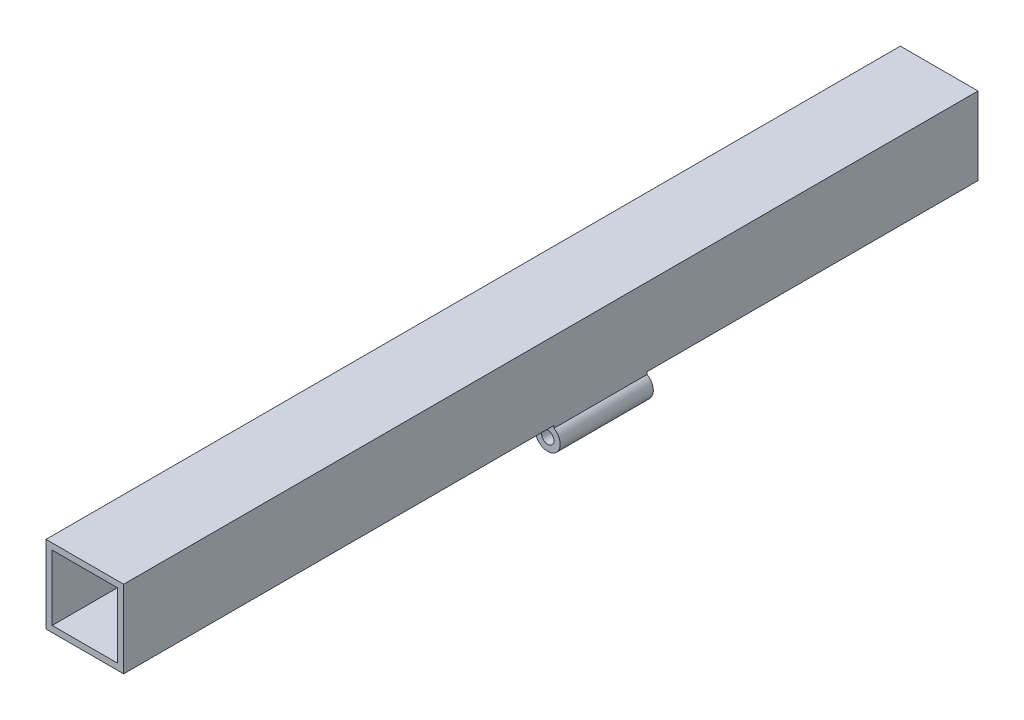
ISO-10303-21;
HEADER;
FILE_DESCRIPTION(('STEP AP214'),'2;1');
FILE_NAME('part.step','',(''),(''),'','','');
FILE_SCHEMA(('AUTOMOTIVE_DESIGN { 1 0 10303 214 1 1 1 1 }'));
ENDSEC;
DATA;
#1=APPLICATION_CONTEXT('core data for automotive mechanical design processes');
#2=APPLICATION_PROTOCOL_DEFINITION('international standard','automotive_design',2000,#1);
#3=PRODUCT_CONTEXT('',#1,'mechanical');
#4=PRODUCT('Part','Part','',(#3));
#5=PRODUCT_RELATED_PRODUCT_CATEGORY('part','',(#4));
#6=PRODUCT_DEFINITION_FORMATION('','',#4);
#7=PRODUCT_DEFINITION_CONTEXT('part definition',#1,'design');
#8=PRODUCT_DEFINITION('design','',#6,#7);
#9=PRODUCT_DEFINITION_SHAPE('','',#8);
#10=(LENGTH_UNIT() NAMED_UNIT(*) SI_UNIT(.MILLI.,.METRE.));
#11=(NAMED_UNIT(*) PLANE_ANGLE_UNIT() SI_UNIT($,.RADIAN.));
#12=(NAMED_UNIT(*) SI_UNIT($,.STERADIAN.) SOLID_ANGLE_UNIT());
#13=UNCERTAINTY_MEASURE_WITH_UNIT(LENGTH_MEASURE(1.E-05),#10,'distance_accuracy_value','');
#14=(GEOMETRIC_REPRESENTATION_CONTEXT(3) GLOBAL_UNCERTAINTY_ASSIGNED_CONTEXT((#13)) GLOBAL_UNIT_ASSIGNED_CONTEXT((#10,
#11,#12)) REPRESENTATION_CONTEXT('',''));
#15=CARTESIAN_POINT('',(0.,0.,0.));
#16=DIRECTION('',(0.,0.,1.));
#17=DIRECTION('',(1.,0.,0.));
#18=AXIS2_PLACEMENT_3D('',#15,#16,#17);
#19=CARTESIAN_POINT('',(-12.5,-12.5,275.));
#20=DIRECTION('',(0.,1.,0.));
#21=DIRECTION('',(0.,0.,1.));
#22=AXIS2_PLACEMENT_3D('',#19,#20,#21);
#23=PLANE('',#22);
#24=DIRECTION('',(-1.,0.,0.));
#25=VECTOR('',#24,1.);
#26=CARTESIAN_POINT('',(8.5,-12.5,136.5));
#27=LINE('',#26,#25);
#28=CARTESIAN_POINT('',(12.5,-12.5,136.5));
#29=VERTEX_POINT('',#28);
#30=CARTESIAN_POINT('',(8.5,-12.5,136.5));
#31=VERTEX_POINT('',#30);
#32=EDGE_CURVE('E55',#29,#31,#27,.T.);
#33=ORIENTED_EDGE('',*,*,#32,.F.);
#34=DIRECTION('',(0.,0.,-1.));
#35=VECTOR('',#34,1.);
#36=CARTESIAN_POINT('',(12.5,-12.5,275.));
#37=LINE('',#36,#35);
#38=CARTESIAN_POINT('',(12.5,-12.5,275.));
#39=VERTEX_POINT('',#38);
#40=EDGE_CURVE('E217',#39,#29,#37,.T.);
#41=ORIENTED_EDGE('',*,*,#40,.F.);
#42=DIRECTION('',(1.,0.,0.));
#43=VECTOR('',#42,1.);
#44=CARTESIAN_POINT('',(-12.5,-12.5,275.));
#45=LINE('',#44,#43);
#46=CARTESIAN_POINT('',(-12.5,-12.5,275.));
#47=VERTEX_POINT('',#46);
#48=EDGE_CURVE('E208',#47,#39,#45,.T.);
#49=ORIENTED_EDGE('',*,*,#48,.F.);
#50=DIRECTION('',(0.,0.,-1.));
#51=VECTOR('',#50,1.);
#52=CARTESIAN_POINT('',(-12.5,-12.5,275.));
#53=LINE('',#52,#51);
#54=CARTESIAN_POINT('',(-12.5,-12.5,0.));
#55=VERTEX_POINT('',#54);
#56=EDGE_CURVE('E220',#47,#55,#53,.T.);
#57=ORIENTED_EDGE('',*,*,#56,.T.);
#58=DIRECTION('',(1.,0.,0.));
#59=VECTOR('',#58,1.);
#60=CARTESIAN_POINT('',(-12.5,-12.5,0.));
#61=LINE('',#60,#59);
#62=CARTESIAN_POINT('',(12.5,-12.5,0.));
#63=VERTEX_POINT('',#62);
#64=EDGE_CURVE('E204',#55,#63,#61,.T.);
#65=ORIENTED_EDGE('',*,*,#64,.T.);
#66=CARTESIAN_POINT('',(12.5,-12.5,106.5));
#67=VERTEX_POINT('',#66);
#68=EDGE_CURVE('E151',#67,#63,#37,.T.);
#69=ORIENTED_EDGE('',*,*,#68,.F.);
#70=DIRECTION('',(-1.,0.,0.));
#71=VECTOR('',#70,1.);
#72=CARTESIAN_POINT('',(8.5,-12.5,106.5));
#73=LINE('',#72,#71);
#74=CARTESIAN_POINT('',(8.5,-12.5,106.5));
#75=VERTEX_POINT('',#74);
#76=EDGE_CURVE('E144',#67,#75,#73,.T.);
#77=ORIENTED_EDGE('',*,*,#76,.T.);
#78=DIRECTION('',(0.,0.,1.));
#79=VECTOR('',#78,1.);
#80=CARTESIAN_POINT('',(8.5,-12.5,106.5));
#81=LINE('',#80,#79);
#82=EDGE_CURVE('E130',#75,#31,#81,.T.);
#83=ORIENTED_EDGE('',*,*,#82,.T.);
#84=EDGE_LOOP('',(#33,#41,#49,#57,#65,#69,#77,#83));
#85=FACE_BOUND('',#84,.T.);
#86=ADVANCED_FACE('F40',(#85),#23,.F.);
#87=CARTESIAN_POINT('',(0.,0.,275.));
#88=DIRECTION('',(0.,0.,-1.));
#89=DIRECTION('',(-1.,0.,0.));
#90=AXIS2_PLACEMENT_3D('',#87,#88,#89);
#91=PLANE('',#90);
#92=DIRECTION('',(0.,1.,0.));
#93=VECTOR('',#92,1.);
#94=CARTESIAN_POINT('',(12.5,-12.5,275.));
#95=LINE('',#94,#93);
#96=CARTESIAN_POINT('',(12.5,12.5,275.));
#97=VERTEX_POINT('',#96);
#98=EDGE_CURVE('E200',#39,#97,#95,.T.);
#99=ORIENTED_EDGE('',*,*,#98,.T.);
#100=DIRECTION('',(-1.,0.,0.));
#101=VECTOR('',#100,1.);
#102=CARTESIAN_POINT('',(-12.5,12.5,275.));
#103=LINE('',#102,#101);
#104=CARTESIAN_POINT('',(-12.5,12.5,275.));
#105=VERTEX_POINT('',#104);
#106=EDGE_CURVE('E203',#97,#105,#103,.T.);
#107=ORIENTED_EDGE('',*,*,#106,.T.);
#108=DIRECTION('',(0.,-1.,0.));
#109=VECTOR('',#108,1.);
#110=CARTESIAN_POINT('',(-12.5,-12.5,275.));
#111=LINE('',#110,#109);
#112=EDGE_CURVE('E206',#105,#47,#111,.T.);
#113=ORIENTED_EDGE('',*,*,#112,.T.);
#114=ORIENTED_EDGE('',*,*,#48,.T.);
#115=EDGE_LOOP('',(#99,#107,#113,#114));
#116=FACE_BOUND('',#115,.T.);
#117=DIRECTION('',(0.,1.,0.));
#118=VECTOR('',#117,1.);
#119=CARTESIAN_POINT('',(10.5,10.5,275.));
#120=LINE('',#119,#118);
#121=CARTESIAN_POINT('',(10.5,-10.5,275.));
#122=VERTEX_POINT('',#121);
#123=CARTESIAN_POINT('',(10.5,10.5,275.));
#124=VERTEX_POINT('',#123);
#125=EDGE_CURVE('E171',#122,#124,#120,.T.);
#126=ORIENTED_EDGE('',*,*,#125,.F.);
#127=DIRECTION('',(1.,0.,0.));
#128=VECTOR('',#127,1.);
#129=CARTESIAN_POINT('',(-10.5,-10.5,275.));
#130=LINE('',#129,#128);
#131=CARTESIAN_POINT('',(-10.5,-10.5,275.));
#132=VERTEX_POINT('',#131);
#133=EDGE_CURVE('E178',#132,#122,#130,.T.);
#134=ORIENTED_EDGE('',*,*,#133,.F.);
#135=DIRECTION('',(0.,-1.,0.));
#136=VECTOR('',#135,1.);
#137=CARTESIAN_POINT('',(-10.5,10.5,275.));
#138=LINE('',#137,#136);
#139=CARTESIAN_POINT('',(-10.5,10.5,275.));
#140=VERTEX_POINT('',#139);
#141=EDGE_CURVE('E176',#140,#132,#138,.T.);
#142=ORIENTED_EDGE('',*,*,#141,.F.);
#143=DIRECTION('',(-1.,0.,0.));
#144=VECTOR('',#143,1.);
#145=CARTESIAN_POINT('',(-10.5,10.5,275.));
#146=LINE('',#145,#144);
#147=EDGE_CURVE('E173',#124,#140,#146,.T.);
#148=ORIENTED_EDGE('',*,*,#147,.F.);
#149=EDGE_LOOP('',(#126,#134,#142,#148));
#150=FACE_BOUND('',#149,.T.);
#151=ADVANCED_FACE('F239',(#116,#150),#91,.F.);
#152=CARTESIAN_POINT('',(0.,0.,0.));
#153=DIRECTION('',(0.,0.,-1.));
#154=DIRECTION('',(-1.,0.,0.));
#155=AXIS2_PLACEMENT_3D('',#152,#153,#154);
#156=PLANE('',#155);
#157=DIRECTION('',(0.,1.,0.));
#158=VECTOR('',#157,1.);
#159=CARTESIAN_POINT('',(12.5,-12.5,0.));
#160=LINE('',#159,#158);
#161=CARTESIAN_POINT('',(12.5,12.5,0.));
#162=VERTEX_POINT('',#161);
#163=EDGE_CURVE('E199',#63,#162,#160,.T.);
#164=ORIENTED_EDGE('',*,*,#163,.F.);
#165=ORIENTED_EDGE('',*,*,#64,.F.);
#166=DIRECTION('',(0.,-1.,0.));
#167=VECTOR('',#166,1.);
#168=CARTESIAN_POINT('',(-12.5,-12.5,0.));
#169=LINE('',#168,#167);
#170=CARTESIAN_POINT('',(-12.5,12.5,0.));
#171=VERTEX_POINT('',#170);
#172=EDGE_CURVE('E214',#171,#55,#169,.T.);
#173=ORIENTED_EDGE('',*,*,#172,.F.);
#174=DIRECTION('',(-1.,0.,0.));
#175=VECTOR('',#174,1.);
#176=CARTESIAN_POINT('',(-12.5,12.5,0.));
#177=LINE('',#176,#175);
#178=EDGE_CURVE('E212',#162,#171,#177,.T.);
#179=ORIENTED_EDGE('',*,*,#178,.F.);
#180=EDGE_LOOP('',(#164,#165,#173,#179));
#181=FACE_BOUND('',#180,.T.);
#182=DIRECTION('',(1.,0.,0.));
#183=VECTOR('',#182,1.);
#184=CARTESIAN_POINT('',(-10.5,-10.5,0.));
#185=LINE('',#184,#183);
#186=CARTESIAN_POINT('',(-10.5,-10.5,0.));
#187=VERTEX_POINT('',#186);
#188=CARTESIAN_POINT('',(10.5,-10.5,0.));
#189=VERTEX_POINT('',#188);
#190=EDGE_CURVE('E174',#187,#189,#185,.T.);
#191=ORIENTED_EDGE('',*,*,#190,.T.);
#192=DIRECTION('',(0.,1.,0.));
#193=VECTOR('',#192,1.);
#194=CARTESIAN_POINT('',(10.5,10.5,0.));
#195=LINE('',#194,#193);
#196=CARTESIAN_POINT('',(10.5,10.5,0.));
#197=VERTEX_POINT('',#196);
#198=EDGE_CURVE('E169',#189,#197,#195,.T.);
#199=ORIENTED_EDGE('',*,*,#198,.T.);
#200=DIRECTION('',(-1.,0.,0.));
#201=VECTOR('',#200,1.);
#202=CARTESIAN_POINT('',(-10.5,10.5,0.));
#203=LINE('',#202,#201);
#204=CARTESIAN_POINT('',(-10.5,10.5,0.));
#205=VERTEX_POINT('',#204);
#206=EDGE_CURVE('E183',#197,#205,#203,.T.);
#207=ORIENTED_EDGE('',*,*,#206,.T.);
#208=DIRECTION('',(0.,-1.,0.));
#209=VECTOR('',#208,1.);
#210=CARTESIAN_POINT('',(-10.5,10.5,0.));
#211=LINE('',#210,#209);
#212=EDGE_CURVE('E186',#205,#187,#211,.T.);
#213=ORIENTED_EDGE('',*,*,#212,.T.);
#214=EDGE_LOOP('',(#191,#199,#207,#213));
#215=FACE_BOUND('',#214,.T.);
#216=ADVANCED_FACE('F233',(#181,#215),#156,.T.);
#217=CARTESIAN_POINT('',(12.5,-12.5,275.));
#218=DIRECTION('',(-1.,0.,0.));
#219=DIRECTION('',(0.,0.,1.));
#220=AXIS2_PLACEMENT_3D('',#217,#218,#219);
#221=PLANE('',#220);
#222=ORIENTED_EDGE('',*,*,#163,.T.);
#223=DIRECTION('',(0.,0.,-1.));
#224=VECTOR('',#223,1.);
#225=CARTESIAN_POINT('',(12.5,12.5,275.));
#226=LINE('',#225,#224);
#227=EDGE_CURVE('E11',#97,#162,#226,.T.);
#228=ORIENTED_EDGE('',*,*,#227,.F.);
#229=ORIENTED_EDGE('',*,*,#98,.F.);
#230=ORIENTED_EDGE('',*,*,#40,.T.);
#231=DIRECTION('',(0.,1.,0.));
#232=VECTOR('',#231,1.);
#233=CARTESIAN_POINT('',(12.5,-12.5,136.5));
#234=LINE('',#233,#232);
#235=CARTESIAN_POINT('',(12.5,-13.2858983848622,136.5));
#236=VERTEX_POINT('',#235);
#237=EDGE_CURVE('E152',#236,#29,#234,.T.);
#238=ORIENTED_EDGE('',*,*,#237,.F.);
#239=DIRECTION('',(0.,0.,1.));
#240=VECTOR('',#239,1.);
#241=CARTESIAN_POINT('',(12.5,-13.2858983848622,106.5));
#242=LINE('',#241,#240);
#243=CARTESIAN_POINT('',(12.5,-13.2858983848622,106.5));
#244=VERTEX_POINT('',#243);
#245=EDGE_CURVE('E167',#244,#236,#242,.T.);
#246=ORIENTED_EDGE('',*,*,#245,.F.);
#247=DIRECTION('',(0.,1.,0.));
#248=VECTOR('',#247,1.);
#249=CARTESIAN_POINT('',(12.5,-12.5,106.5));
#250=LINE('',#249,#248);
#251=EDGE_CURVE('E138',#244,#67,#250,.T.);
#252=ORIENTED_EDGE('',*,*,#251,.T.);
#253=ORIENTED_EDGE('',*,*,#68,.T.);
#254=EDGE_LOOP('',(#222,#228,#229,#230,#238,#246,#252,#253));
#255=FACE_BOUND('',#254,.T.);
#256=ADVANCED_FACE('F42',(#255),#221,.F.);
#257=CARTESIAN_POINT('',(-12.5,12.5,275.));
#258=DIRECTION('',(0.,-1.,0.));
#259=DIRECTION('',(0.,0.,-1.));
#260=AXIS2_PLACEMENT_3D('',#257,#258,#259);
#261=PLANE('',#260);
#262=ORIENTED_EDGE('',*,*,#178,.T.);
#263=DIRECTION('',(0.,0.,-1.));
#264=VECTOR('',#263,1.);
#265=CARTESIAN_POINT('',(-12.5,12.5,275.));
#266=LINE('',#265,#264);
#267=EDGE_CURVE('E48',#105,#171,#266,.T.);
#268=ORIENTED_EDGE('',*,*,#267,.F.);
#269=ORIENTED_EDGE('',*,*,#106,.F.);
#270=ORIENTED_EDGE('',*,*,#227,.T.);
#271=EDGE_LOOP('',(#262,#268,#269,#270));
#272=FACE_BOUND('',#271,.T.);
#273=ADVANCED_FACE('F242',(#272),#261,.F.);
#274=CARTESIAN_POINT('',(-12.5,-12.5,275.));
#275=DIRECTION('',(1.,0.,0.));
#276=DIRECTION('',(0.,0.,-1.));
#277=AXIS2_PLACEMENT_3D('',#274,#275,#276);
#278=PLANE('',#277);
#279=ORIENTED_EDGE('',*,*,#172,.T.);
#280=ORIENTED_EDGE('',*,*,#56,.F.);
#281=ORIENTED_EDGE('',*,*,#112,.F.);
#282=ORIENTED_EDGE('',*,*,#267,.T.);
#283=EDGE_LOOP('',(#279,#280,#281,#282));
#284=FACE_BOUND('',#283,.T.);
#285=ADVANCED_FACE('F227',(#284),#278,.F.);
#286=CARTESIAN_POINT('',(10.5,10.5,275.));
#287=DIRECTION('',(-1.,0.,0.));
#288=DIRECTION('',(0.,0.,1.));
#289=AXIS2_PLACEMENT_3D('',#286,#287,#288);
#290=PLANE('',#289);
#291=ORIENTED_EDGE('',*,*,#198,.F.);
#292=DIRECTION('',(0.,0.,-1.));
#293=VECTOR('',#292,1.);
#294=CARTESIAN_POINT('',(10.5,-10.5,275.));
#295=LINE('',#294,#293);
#296=EDGE_CURVE('E180',#122,#189,#295,.T.);
#297=ORIENTED_EDGE('',*,*,#296,.F.);
#298=ORIENTED_EDGE('',*,*,#125,.T.);
#299=DIRECTION('',(0.,0.,-1.));
#300=VECTOR('',#299,1.);
#301=CARTESIAN_POINT('',(10.5,10.5,275.));
#302=LINE('',#301,#300);
#303=EDGE_CURVE('E196',#124,#197,#302,.T.);
#304=ORIENTED_EDGE('',*,*,#303,.T.);
#305=EDGE_LOOP('',(#291,#297,#298,#304));
#306=FACE_BOUND('',#305,.T.);
#307=ADVANCED_FACE('F272',(#306),#290,.T.);
#308=CARTESIAN_POINT('',(-10.5,10.5,275.));
#309=DIRECTION('',(0.,-1.,0.));
#310=DIRECTION('',(0.,0.,-1.));
#311=AXIS2_PLACEMENT_3D('',#308,#309,#310);
#312=PLANE('',#311);
#313=ORIENTED_EDGE('',*,*,#206,.F.);
#314=ORIENTED_EDGE('',*,*,#303,.F.);
#315=ORIENTED_EDGE('',*,*,#147,.T.);
#316=DIRECTION('',(0.,0.,-1.));
#317=VECTOR('',#316,1.);
#318=CARTESIAN_POINT('',(-10.5,10.5,275.));
#319=LINE('',#318,#317);
#320=EDGE_CURVE('E194',#140,#205,#319,.T.);
#321=ORIENTED_EDGE('',*,*,#320,.T.);
#322=EDGE_LOOP('',(#313,#314,#315,#321));
#323=FACE_BOUND('',#322,.T.);
#324=ADVANCED_FACE('F316',(#323),#312,.T.);
#325=CARTESIAN_POINT('',(-10.5,10.5,275.));
#326=DIRECTION('',(1.,0.,0.));
#327=DIRECTION('',(0.,0.,-1.));
#328=AXIS2_PLACEMENT_3D('',#325,#326,#327);
#329=PLANE('',#328);
#330=ORIENTED_EDGE('',*,*,#212,.F.);
#331=ORIENTED_EDGE('',*,*,#320,.F.);
#332=ORIENTED_EDGE('',*,*,#141,.T.);
#333=DIRECTION('',(0.,0.,-1.));
#334=VECTOR('',#333,1.);
#335=CARTESIAN_POINT('',(-10.5,-10.5,275.));
#336=LINE('',#335,#334);
#337=EDGE_CURVE('E63',#132,#187,#336,.T.);
#338=ORIENTED_EDGE('',*,*,#337,.T.);
#339=EDGE_LOOP('',(#330,#331,#332,#338));
#340=FACE_BOUND('',#339,.T.);
#341=ADVANCED_FACE('F325',(#340),#329,.T.);
#342=CARTESIAN_POINT('',(-10.5,-10.5,275.));
#343=DIRECTION('',(0.,1.,0.));
#344=DIRECTION('',(0.,0.,1.));
#345=AXIS2_PLACEMENT_3D('',#342,#343,#344);
#346=PLANE('',#345);
#347=ORIENTED_EDGE('',*,*,#190,.F.);
#348=ORIENTED_EDGE('',*,*,#337,.F.);
#349=ORIENTED_EDGE('',*,*,#133,.T.);
#350=ORIENTED_EDGE('',*,*,#296,.T.);
#351=EDGE_LOOP('',(#347,#348,#349,#350));
#352=FACE_BOUND('',#351,.T.);
#353=ADVANCED_FACE('F334',(#352),#346,.T.);
#354=CARTESIAN_POINT('',(10.5,-16.75,106.5));
#355=DIRECTION('',(0.,0.,1.));
#356=DIRECTION('',(1.,0.,0.));
#357=AXIS2_PLACEMENT_3D('',#354,#355,#356);
#358=CYLINDRICAL_SURFACE('',#357,4.);
#359=CARTESIAN_POINT('',(10.5,-16.75,136.5));
#360=DIRECTION('',(0.,0.,1.));
#361=DIRECTION('',(1.,0.,0.));
#362=AXIS2_PLACEMENT_3D('',#359,#360,#361);
#363=CIRCLE('',#362,4.);
#364=CARTESIAN_POINT('',(8.5,-13.2858983848622,136.5));
#365=VERTEX_POINT('',#364);
#366=EDGE_CURVE('E154',#365,#236,#363,.T.);
#367=ORIENTED_EDGE('',*,*,#366,.F.);
#368=DIRECTION('',(0.,0.,1.));
#369=VECTOR('',#368,1.);
#370=CARTESIAN_POINT('',(8.5,-13.2858983848622,106.5));
#371=LINE('',#370,#369);
#372=CARTESIAN_POINT('',(8.5,-13.2858983848622,106.5));
#373=VERTEX_POINT('',#372);
#374=EDGE_CURVE('E137',#373,#365,#371,.T.);
#375=ORIENTED_EDGE('',*,*,#374,.F.);
#376=CARTESIAN_POINT('',(10.5,-16.75,106.5));
#377=DIRECTION('',(0.,0.,1.));
#378=DIRECTION('',(1.,0.,0.));
#379=AXIS2_PLACEMENT_3D('',#376,#377,#378);
#380=CIRCLE('',#379,4.);
#381=EDGE_CURVE('E147',#373,#244,#380,.T.);
#382=ORIENTED_EDGE('',*,*,#381,.T.);
#383=ORIENTED_EDGE('',*,*,#245,.T.);
#384=EDGE_LOOP('',(#367,#375,#382,#383));
#385=FACE_BOUND('',#384,.T.);
#386=ADVANCED_FACE('F247',(#385),#358,.T.);
#387=CARTESIAN_POINT('',(8.5,-13.2858983848622,106.5));
#388=DIRECTION('',(-1.,0.,0.));
#389=DIRECTION('',(0.,0.,1.));
#390=AXIS2_PLACEMENT_3D('',#387,#388,#389);
#391=PLANE('',#390);
#392=DIRECTION('',(0.,-1.,0.));
#393=VECTOR('',#392,1.);
#394=CARTESIAN_POINT('',(8.5,-13.2858983848622,136.5));
#395=LINE('',#394,#393);
#396=EDGE_CURVE('E134',#31,#365,#395,.T.);
#397=ORIENTED_EDGE('',*,*,#396,.F.);
#398=ORIENTED_EDGE('',*,*,#82,.F.);
#399=DIRECTION('',(0.,-1.,0.));
#400=VECTOR('',#399,1.);
#401=CARTESIAN_POINT('',(8.5,-13.2858983848622,106.5));
#402=LINE('',#401,#400);
#403=EDGE_CURVE('E133',#75,#373,#402,.T.);
#404=ORIENTED_EDGE('',*,*,#403,.T.);
#405=ORIENTED_EDGE('',*,*,#374,.T.);
#406=EDGE_LOOP('',(#397,#398,#404,#405));
#407=FACE_BOUND('',#406,.T.);
#408=ADVANCED_FACE('F132',(#407),#391,.T.);
#409=CARTESIAN_POINT('',(10.5,-16.75,106.5));
#410=DIRECTION('',(0.,0.,1.));
#411=DIRECTION('',(1.,0.,0.));
#412=AXIS2_PLACEMENT_3D('',#409,#410,#411);
#413=PLANE('',#412);
#414=CARTESIAN_POINT('',(10.5,-16.75,106.5));
#415=DIRECTION('',(0.,0.,1.));
#416=DIRECTION('',(1.,0.,0.));
#417=AXIS2_PLACEMENT_3D('',#414,#415,#416);
#418=CIRCLE('',#417,2.);
#419=CARTESIAN_POINT('',(12.5,-16.75,106.5));
#420=VERTEX_POINT('',#419);
#421=EDGE_CURVE('E163',#420,#420,#418,.T.);
#422=ORIENTED_EDGE('',*,*,#421,.T.);
#423=EDGE_LOOP('',(#422));
#424=FACE_BOUND('',#423,.T.);
#425=ORIENTED_EDGE('',*,*,#76,.F.);
#426=ORIENTED_EDGE('',*,*,#251,.F.);
#427=ORIENTED_EDGE('',*,*,#381,.F.);
#428=ORIENTED_EDGE('',*,*,#403,.F.);
#429=EDGE_LOOP('',(#425,#426,#427,#428));
#430=FACE_BOUND('',#429,.T.);
#431=ADVANCED_FACE('F142',(#424,#430),#413,.F.);
#432=CARTESIAN_POINT('',(10.5,-16.75,136.5));
#433=DIRECTION('',(0.,0.,1.));
#434=DIRECTION('',(1.,0.,0.));
#435=AXIS2_PLACEMENT_3D('',#432,#433,#434);
#436=PLANE('',#435);
#437=CARTESIAN_POINT('',(10.5,-16.75,136.5));
#438=DIRECTION('',(0.,0.,1.));
#439=DIRECTION('',(1.,0.,0.));
#440=AXIS2_PLACEMENT_3D('',#437,#438,#439);
#441=CIRCLE('',#440,2.);
#442=CARTESIAN_POINT('',(12.5,-16.75,136.5));
#443=VERTEX_POINT('',#442);
#444=EDGE_CURVE('E157',#443,#443,#441,.T.);
#445=ORIENTED_EDGE('',*,*,#444,.F.);
#446=EDGE_LOOP('',(#445));
#447=FACE_BOUND('',#446,.T.);
#448=ORIENTED_EDGE('',*,*,#32,.T.);
#449=ORIENTED_EDGE('',*,*,#396,.T.);
#450=ORIENTED_EDGE('',*,*,#366,.T.);
#451=ORIENTED_EDGE('',*,*,#237,.T.);
#452=EDGE_LOOP('',(#448,#449,#450,#451));
#453=FACE_BOUND('',#452,.T.);
#454=ADVANCED_FACE('F248',(#447,#453),#436,.T.);
#455=CARTESIAN_POINT('',(10.5,-16.75,106.5));
#456=DIRECTION('',(0.,0.,1.));
#457=DIRECTION('',(1.,0.,0.));
#458=AXIS2_PLACEMENT_3D('',#455,#456,#457);
#459=CYLINDRICAL_SURFACE('',#458,2.);
#460=ORIENTED_EDGE('',*,*,#421,.F.);
#461=EDGE_LOOP('',(#460));
#462=FACE_BOUND('',#461,.T.);
#463=ORIENTED_EDGE('',*,*,#444,.T.);
#464=EDGE_LOOP('',(#463));
#465=FACE_BOUND('',#464,.T.);
#466=ADVANCED_FACE('F250',(#462,#465),#459,.F.);
#467=CLOSED_SHELL('',(#86,#151,#216,#256,#273,#285,#307,#324,#341,#353,#386,#408,#431,#454,#466));
#468=MANIFOLD_SOLID_BREP('B2',#467);
#469=ADVANCED_BREP_SHAPE_REPRESENTATION('',(#18,#468),#14);
#470=SHAPE_DEFINITION_REPRESENTATION(#9,#469);
ENDSEC;
END-ISO-10303-21;
